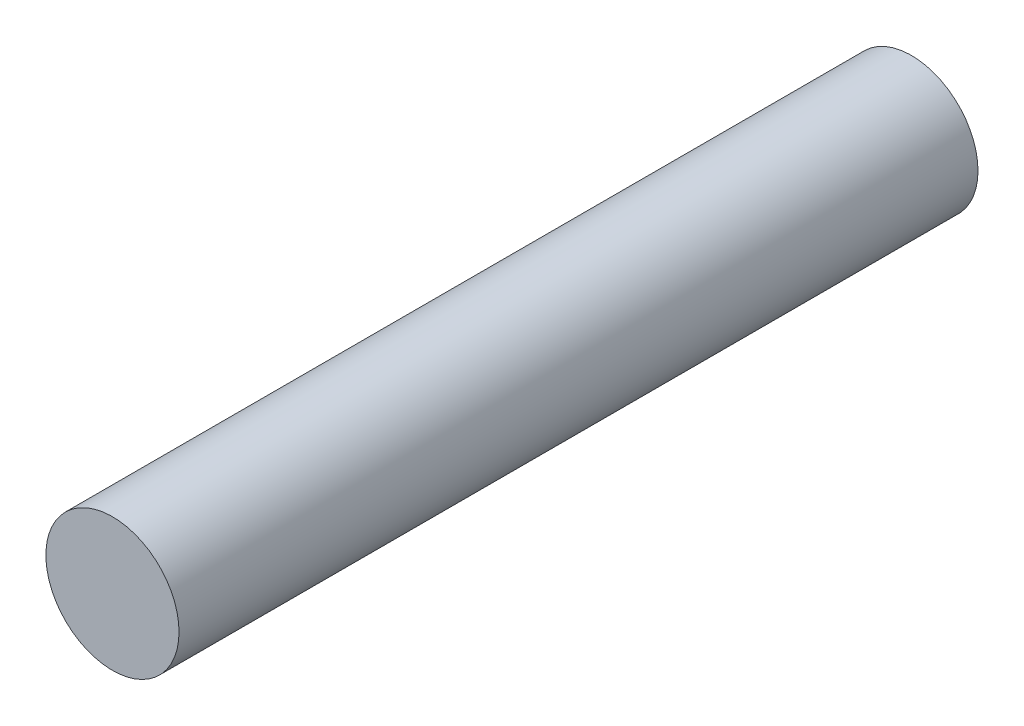
ISO-10303-21;
HEADER;
FILE_DESCRIPTION(('STEP AP214'),'2;1');
FILE_NAME('part.step','',(''),(''),'','','');
FILE_SCHEMA(('AUTOMOTIVE_DESIGN { 1 0 10303 214 1 1 1 1 }'));
ENDSEC;
DATA;
#1=APPLICATION_CONTEXT('core data for automotive mechanical design processes');
#2=APPLICATION_PROTOCOL_DEFINITION('international standard','automotive_design',2000,#1);
#3=PRODUCT_CONTEXT('',#1,'mechanical');
#4=PRODUCT('Part','Part','',(#3));
#5=PRODUCT_RELATED_PRODUCT_CATEGORY('part','',(#4));
#6=PRODUCT_DEFINITION_FORMATION('','',#4);
#7=PRODUCT_DEFINITION_CONTEXT('part definition',#1,'design');
#8=PRODUCT_DEFINITION('design','',#6,#7);
#9=PRODUCT_DEFINITION_SHAPE('','',#8);
#10=(LENGTH_UNIT() NAMED_UNIT(*) SI_UNIT(.MILLI.,.METRE.));
#11=(NAMED_UNIT(*) PLANE_ANGLE_UNIT() SI_UNIT($,.RADIAN.));
#12=(NAMED_UNIT(*) SI_UNIT($,.STERADIAN.) SOLID_ANGLE_UNIT());
#13=UNCERTAINTY_MEASURE_WITH_UNIT(LENGTH_MEASURE(1.E-05),#10,'distance_accuracy_value','');
#14=(GEOMETRIC_REPRESENTATION_CONTEXT(3) GLOBAL_UNCERTAINTY_ASSIGNED_CONTEXT((#13)) GLOBAL_UNIT_ASSIGNED_CONTEXT((#10,
#11,#12)) REPRESENTATION_CONTEXT('',''));
#15=CARTESIAN_POINT('',(0.,0.,0.));
#16=DIRECTION('',(0.,0.,1.));
#17=DIRECTION('',(1.,0.,0.));
#18=AXIS2_PLACEMENT_3D('',#15,#16,#17);
#19=CARTESIAN_POINT('',(0.,0.,300.));
#20=DIRECTION('',(0.,0.,-1.));
#21=DIRECTION('',(-1.,0.,0.));
#22=AXIS2_PLACEMENT_3D('',#19,#20,#21);
#23=CYLINDRICAL_SURFACE('',#22,25.);
#24=CARTESIAN_POINT('',(0.,0.,300.));
#25=DIRECTION('',(0.,0.,1.));
#26=DIRECTION('',(1.,0.,0.));
#27=AXIS2_PLACEMENT_3D('',#24,#25,#26);
#28=CIRCLE('',#27,25.);
#29=CARTESIAN_POINT('',(25.,0.,300.));
#30=VERTEX_POINT('',#29);
#31=EDGE_CURVE('E10',#30,#30,#28,.T.);
#32=ORIENTED_EDGE('',*,*,#31,.F.);
#33=EDGE_LOOP('',(#32));
#34=FACE_BOUND('',#33,.T.);
#35=CARTESIAN_POINT('',(0.,0.,0.));
#36=DIRECTION('',(0.,0.,1.));
#37=DIRECTION('',(1.,0.,0.));
#38=AXIS2_PLACEMENT_3D('',#35,#36,#37);
#39=CIRCLE('',#38,25.);
#40=CARTESIAN_POINT('',(25.,0.,0.));
#41=VERTEX_POINT('',#40);
#42=EDGE_CURVE('E38',#41,#41,#39,.T.);
#43=ORIENTED_EDGE('',*,*,#42,.T.);
#44=EDGE_LOOP('',(#43));
#45=FACE_BOUND('',#44,.T.);
#46=ADVANCED_FACE('F35',(#34,#45),#23,.T.);
#47=CARTESIAN_POINT('',(0.,0.,300.));
#48=DIRECTION('',(0.,0.,1.));
#49=DIRECTION('',(1.,0.,0.));
#50=AXIS2_PLACEMENT_3D('',#47,#48,#49);
#51=PLANE('',#50);
#52=ORIENTED_EDGE('',*,*,#31,.T.);
#53=EDGE_LOOP('',(#52));
#54=FACE_BOUND('',#53,.T.);
#55=ADVANCED_FACE('F50',(#54),#51,.T.);
#56=CARTESIAN_POINT('',(0.,0.,0.));
#57=DIRECTION('',(0.,0.,1.));
#58=DIRECTION('',(1.,0.,0.));
#59=AXIS2_PLACEMENT_3D('',#56,#57,#58);
#60=PLANE('',#59);
#61=ORIENTED_EDGE('',*,*,#42,.F.);
#62=EDGE_LOOP('',(#61));
#63=FACE_BOUND('',#62,.T.);
#64=ADVANCED_FACE('F48',(#63),#60,.F.);
#65=CLOSED_SHELL('',(#46,#55,#64));
#66=MANIFOLD_SOLID_BREP('B2',#65);
#67=ADVANCED_BREP_SHAPE_REPRESENTATION('',(#18,#66),#14);
#68=SHAPE_DEFINITION_REPRESENTATION(#9,#67);
ENDSEC;
END-ISO-10303-21;
